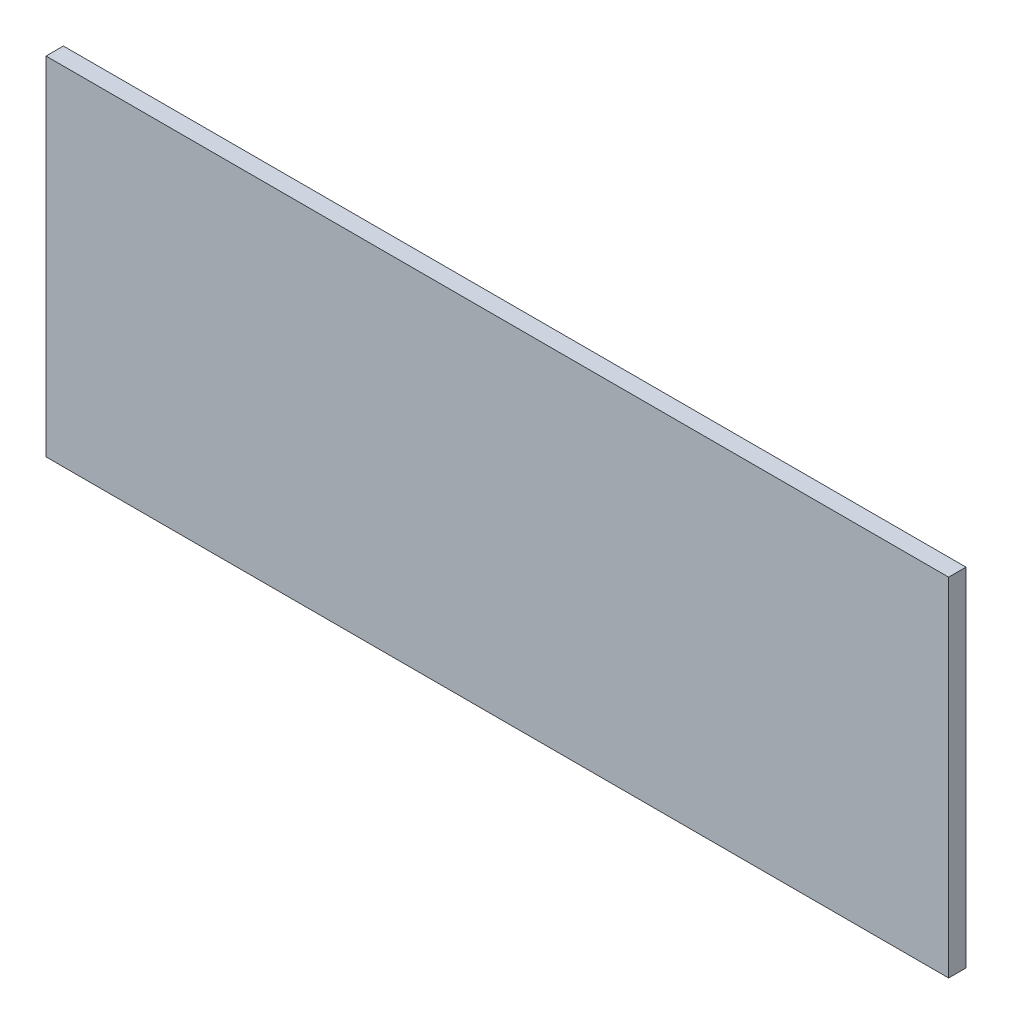
ISO-10303-21;
HEADER;
FILE_DESCRIPTION(('STEP AP214'),'2;1');
FILE_NAME('part.step','',(''),(''),'','','');
FILE_SCHEMA(('AUTOMOTIVE_DESIGN { 1 0 10303 214 1 1 1 1 }'));
ENDSEC;
DATA;
#1=APPLICATION_CONTEXT('core data for automotive mechanical design processes');
#2=APPLICATION_PROTOCOL_DEFINITION('international standard','automotive_design',2000,#1);
#3=PRODUCT_CONTEXT('',#1,'mechanical');
#4=PRODUCT('Part','Part','',(#3));
#5=PRODUCT_RELATED_PRODUCT_CATEGORY('part','',(#4));
#6=PRODUCT_DEFINITION_FORMATION('','',#4);
#7=PRODUCT_DEFINITION_CONTEXT('part definition',#1,'design');
#8=PRODUCT_DEFINITION('design','',#6,#7);
#9=PRODUCT_DEFINITION_SHAPE('','',#8);
#10=(LENGTH_UNIT() NAMED_UNIT(*) SI_UNIT(.MILLI.,.METRE.));
#11=(NAMED_UNIT(*) PLANE_ANGLE_UNIT() SI_UNIT($,.RADIAN.));
#12=(NAMED_UNIT(*) SI_UNIT($,.STERADIAN.) SOLID_ANGLE_UNIT());
#13=UNCERTAINTY_MEASURE_WITH_UNIT(LENGTH_MEASURE(1.E-05),#10,'distance_accuracy_value','');
#14=(GEOMETRIC_REPRESENTATION_CONTEXT(3) GLOBAL_UNCERTAINTY_ASSIGNED_CONTEXT((#13)) GLOBAL_UNIT_ASSIGNED_CONTEXT((#10,
#11,#12)) REPRESENTATION_CONTEXT('',''));
#15=CARTESIAN_POINT('',(0.,0.,0.));
#16=DIRECTION('',(0.,0.,1.));
#17=DIRECTION('',(1.,0.,0.));
#18=AXIS2_PLACEMENT_3D('',#15,#16,#17);
#19=CARTESIAN_POINT('',(79.5,-7.51550014417254,3.));
#20=DIRECTION('',(-1.,0.,0.));
#21=DIRECTION('',(0.,0.,1.));
#22=AXIS2_PLACEMENT_3D('',#19,#20,#21);
#23=PLANE('',#22);
#24=DIRECTION('',(0.,1.,0.));
#25=VECTOR('',#24,1.);
#26=CARTESIAN_POINT('',(79.5,-7.51550014417254,0.));
#27=LINE('',#26,#25);
#28=CARTESIAN_POINT('',(79.5,-7.51550014417254,0.));
#29=VERTEX_POINT('',#28);
#30=CARTESIAN_POINT('',(79.5,52.4844998558275,0.));
#31=VERTEX_POINT('',#30);
#32=EDGE_CURVE('E96',#29,#31,#27,.T.);
#33=ORIENTED_EDGE('',*,*,#32,.T.);
#34=DIRECTION('',(0.,0.,-1.));
#35=VECTOR('',#34,1.);
#36=CARTESIAN_POINT('',(79.5,52.4844998558275,3.));
#37=LINE('',#36,#35);
#38=CARTESIAN_POINT('',(79.5,52.4844998558275,3.));
#39=VERTEX_POINT('',#38);
#40=EDGE_CURVE('E11',#39,#31,#37,.T.);
#41=ORIENTED_EDGE('',*,*,#40,.F.);
#42=DIRECTION('',(0.,1.,0.));
#43=VECTOR('',#42,1.);
#44=CARTESIAN_POINT('',(79.5,-7.51550014417254,3.));
#45=LINE('',#44,#43);
#46=CARTESIAN_POINT('',(79.5,-7.51550014417254,3.));
#47=VERTEX_POINT('',#46);
#48=EDGE_CURVE('E84',#47,#39,#45,.T.);
#49=ORIENTED_EDGE('',*,*,#48,.F.);
#50=DIRECTION('',(0.,0.,-1.));
#51=VECTOR('',#50,1.);
#52=CARTESIAN_POINT('',(79.5,-7.51550014417254,3.));
#53=LINE('',#52,#51);
#54=EDGE_CURVE('E92',#47,#29,#53,.T.);
#55=ORIENTED_EDGE('',*,*,#54,.T.);
#56=EDGE_LOOP('',(#33,#41,#49,#55));
#57=FACE_BOUND('',#56,.T.);
#58=ADVANCED_FACE('F33',(#57),#23,.F.);
#59=CARTESIAN_POINT('',(-76.5,52.4844998558275,3.));
#60=DIRECTION('',(0.,-1.,0.));
#61=DIRECTION('',(0.,0.,-1.));
#62=AXIS2_PLACEMENT_3D('',#59,#60,#61);
#63=PLANE('',#62);
#64=DIRECTION('',(-1.,0.,0.));
#65=VECTOR('',#64,1.);
#66=CARTESIAN_POINT('',(-76.5,52.4844998558275,0.));
#67=LINE('',#66,#65);
#68=CARTESIAN_POINT('',(-76.5,52.4844998558275,0.));
#69=VERTEX_POINT('',#68);
#70=EDGE_CURVE('E88',#31,#69,#67,.T.);
#71=ORIENTED_EDGE('',*,*,#70,.T.);
#72=DIRECTION('',(0.,0.,-1.));
#73=VECTOR('',#72,1.);
#74=CARTESIAN_POINT('',(-76.5,52.4844998558275,3.));
#75=LINE('',#74,#73);
#76=CARTESIAN_POINT('',(-76.5,52.4844998558275,3.));
#77=VERTEX_POINT('',#76);
#78=EDGE_CURVE('E41',#77,#69,#75,.T.);
#79=ORIENTED_EDGE('',*,*,#78,.F.);
#80=DIRECTION('',(-1.,0.,0.));
#81=VECTOR('',#80,1.);
#82=CARTESIAN_POINT('',(-76.5,52.4844998558275,3.));
#83=LINE('',#82,#81);
#84=EDGE_CURVE('E79',#39,#77,#83,.T.);
#85=ORIENTED_EDGE('',*,*,#84,.F.);
#86=ORIENTED_EDGE('',*,*,#40,.T.);
#87=EDGE_LOOP('',(#71,#79,#85,#86));
#88=FACE_BOUND('',#87,.T.);
#89=ADVANCED_FACE('F87',(#88),#63,.F.);
#90=CARTESIAN_POINT('',(-76.5,-7.51550014417254,3.));
#91=DIRECTION('',(1.,0.,0.));
#92=DIRECTION('',(0.,0.,-1.));
#93=AXIS2_PLACEMENT_3D('',#90,#91,#92);
#94=PLANE('',#93);
#95=DIRECTION('',(0.,-1.,0.));
#96=VECTOR('',#95,1.);
#97=CARTESIAN_POINT('',(-76.5,-7.51550014417254,0.));
#98=LINE('',#97,#96);
#99=CARTESIAN_POINT('',(-76.5,-7.51550014417254,0.));
#100=VERTEX_POINT('',#99);
#101=EDGE_CURVE('E66',#69,#100,#98,.T.);
#102=ORIENTED_EDGE('',*,*,#101,.T.);
#103=DIRECTION('',(0.,0.,-1.));
#104=VECTOR('',#103,1.);
#105=CARTESIAN_POINT('',(-76.5,-7.51550014417254,3.));
#106=LINE('',#105,#104);
#107=CARTESIAN_POINT('',(-76.5,-7.51550014417254,3.));
#108=VERTEX_POINT('',#107);
#109=EDGE_CURVE('E89',#108,#100,#106,.T.);
#110=ORIENTED_EDGE('',*,*,#109,.F.);
#111=DIRECTION('',(0.,-1.,0.));
#112=VECTOR('',#111,1.);
#113=CARTESIAN_POINT('',(-76.5,-7.51550014417254,3.));
#114=LINE('',#113,#112);
#115=EDGE_CURVE('E82',#77,#108,#114,.T.);
#116=ORIENTED_EDGE('',*,*,#115,.F.);
#117=ORIENTED_EDGE('',*,*,#78,.T.);
#118=EDGE_LOOP('',(#102,#110,#116,#117));
#119=FACE_BOUND('',#118,.T.);
#120=ADVANCED_FACE('F90',(#119),#94,.F.);
#121=CARTESIAN_POINT('',(-76.5,-7.51550014417254,3.));
#122=DIRECTION('',(0.,1.,0.));
#123=DIRECTION('',(0.,0.,1.));
#124=AXIS2_PLACEMENT_3D('',#121,#122,#123);
#125=PLANE('',#124);
#126=DIRECTION('',(1.,0.,0.));
#127=VECTOR('',#126,1.);
#128=CARTESIAN_POINT('',(-76.5,-7.51550014417254,0.));
#129=LINE('',#128,#127);
#130=EDGE_CURVE('E72',#100,#29,#129,.T.);
#131=ORIENTED_EDGE('',*,*,#130,.T.);
#132=ORIENTED_EDGE('',*,*,#54,.F.);
#133=DIRECTION('',(1.,0.,0.));
#134=VECTOR('',#133,1.);
#135=CARTESIAN_POINT('',(-76.5,-7.51550014417254,3.));
#136=LINE('',#135,#134);
#137=EDGE_CURVE('E49',#108,#47,#136,.T.);
#138=ORIENTED_EDGE('',*,*,#137,.F.);
#139=ORIENTED_EDGE('',*,*,#109,.T.);
#140=EDGE_LOOP('',(#131,#132,#138,#139));
#141=FACE_BOUND('',#140,.T.);
#142=ADVANCED_FACE('F103',(#141),#125,.F.);
#143=CARTESIAN_POINT('',(0.,0.,3.));
#144=DIRECTION('',(0.,0.,-1.));
#145=DIRECTION('',(-1.,0.,0.));
#146=AXIS2_PLACEMENT_3D('',#143,#144,#145);
#147=PLANE('',#146);
#148=ORIENTED_EDGE('',*,*,#48,.T.);
#149=ORIENTED_EDGE('',*,*,#84,.T.);
#150=ORIENTED_EDGE('',*,*,#115,.T.);
#151=ORIENTED_EDGE('',*,*,#137,.T.);
#152=EDGE_LOOP('',(#148,#149,#150,#151));
#153=FACE_BOUND('',#152,.T.);
#154=ADVANCED_FACE('F80',(#153),#147,.F.);
#155=CARTESIAN_POINT('',(0.,0.,0.));
#156=DIRECTION('',(0.,0.,-1.));
#157=DIRECTION('',(-1.,0.,0.));
#158=AXIS2_PLACEMENT_3D('',#155,#156,#157);
#159=PLANE('',#158);
#160=ORIENTED_EDGE('',*,*,#32,.F.);
#161=ORIENTED_EDGE('',*,*,#130,.F.);
#162=ORIENTED_EDGE('',*,*,#101,.F.);
#163=ORIENTED_EDGE('',*,*,#70,.F.);
#164=EDGE_LOOP('',(#160,#161,#162,#163));
#165=FACE_BOUND('',#164,.T.);
#166=ADVANCED_FACE('F106',(#165),#159,.T.);
#167=CLOSED_SHELL('',(#58,#89,#120,#142,#154,#166));
#168=MANIFOLD_SOLID_BREP('B2',#167);
#169=ADVANCED_BREP_SHAPE_REPRESENTATION('',(#18,#168),#14);
#170=SHAPE_DEFINITION_REPRESENTATION(#9,#169);
ENDSEC;
END-ISO-10303-21;
